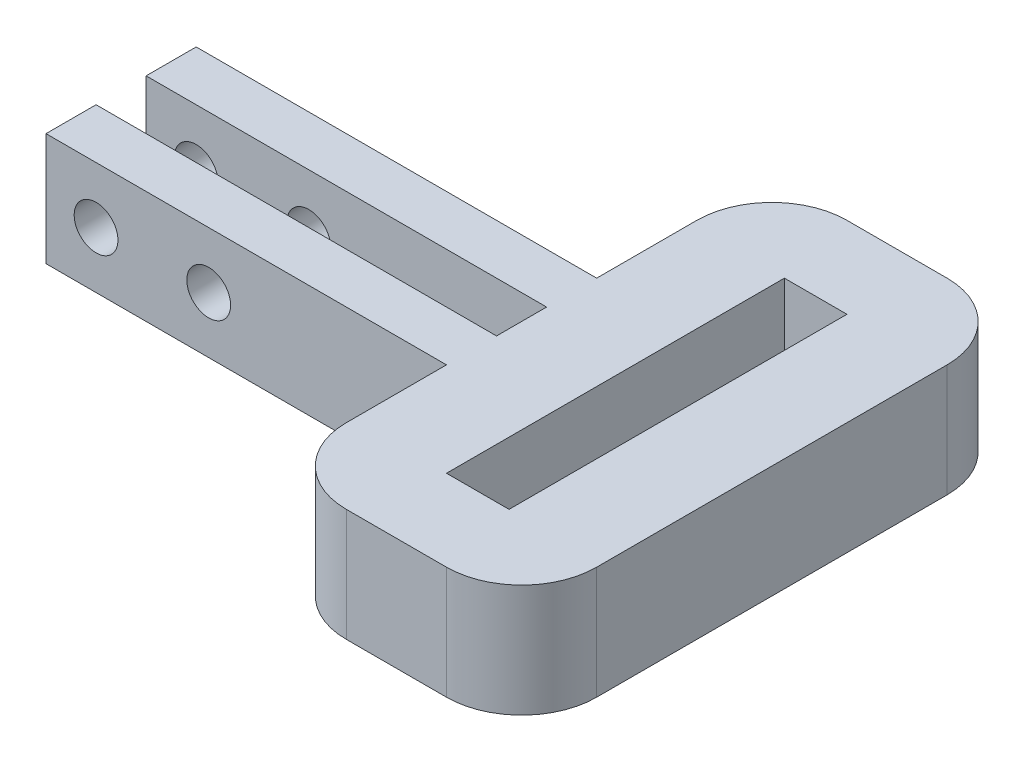
ISO-10303-21;
HEADER;
FILE_DESCRIPTION(('STEP AP214'),'2;1');
FILE_NAME('part.step','',(''),(''),'','','');
FILE_SCHEMA(('AUTOMOTIVE_DESIGN { 1 0 10303 214 1 1 1 1 }'));
ENDSEC;
DATA;
#1=APPLICATION_CONTEXT('core data for automotive mechanical design processes');
#2=APPLICATION_PROTOCOL_DEFINITION('international standard','automotive_design',2000,#1);
#3=PRODUCT_CONTEXT('',#1,'mechanical');
#4=PRODUCT('Part','Part','',(#3));
#5=PRODUCT_RELATED_PRODUCT_CATEGORY('part','',(#4));
#6=PRODUCT_DEFINITION_FORMATION('','',#4);
#7=PRODUCT_DEFINITION_CONTEXT('part definition',#1,'design');
#8=PRODUCT_DEFINITION('design','',#6,#7);
#9=PRODUCT_DEFINITION_SHAPE('','',#8);
#10=(LENGTH_UNIT() NAMED_UNIT(*) SI_UNIT(.MILLI.,.METRE.));
#11=(NAMED_UNIT(*) PLANE_ANGLE_UNIT() SI_UNIT($,.RADIAN.));
#12=(NAMED_UNIT(*) SI_UNIT($,.STERADIAN.) SOLID_ANGLE_UNIT());
#13=UNCERTAINTY_MEASURE_WITH_UNIT(LENGTH_MEASURE(1.E-05),#10,'distance_accuracy_value','');
#14=(GEOMETRIC_REPRESENTATION_CONTEXT(3) GLOBAL_UNCERTAINTY_ASSIGNED_CONTEXT((#13)) GLOBAL_UNIT_ASSIGNED_CONTEXT((#10,
#11,#12)) REPRESENTATION_CONTEXT('',''));
#15=CARTESIAN_POINT('',(0.,0.,0.));
#16=DIRECTION('',(0.,0.,1.));
#17=DIRECTION('',(1.,0.,0.));
#18=AXIS2_PLACEMENT_3D('',#15,#16,#17);
#19=CARTESIAN_POINT('',(-2.,4.5,-7.00000000000001));
#20=DIRECTION('',(0.,-1.,0.));
#21=DIRECTION('',(0.,0.,-1.));
#22=AXIS2_PLACEMENT_3D('',#19,#20,#21);
#23=PLANE('',#22);
#24=CARTESIAN_POINT('',(-2.,4.5,-7.00000000000001));
#25=DIRECTION('',(0.,1.,0.));
#26=DIRECTION('',(0.,0.,-1.));
#27=AXIS2_PLACEMENT_3D('',#24,#25,#26);
#28=CIRCLE('',#27,3.);
#29=CARTESIAN_POINT('',(-2.,4.5,-10.));
#30=VERTEX_POINT('',#29);
#31=CARTESIAN_POINT('',(-5.,4.5,-7.00000000000001));
#32=VERTEX_POINT('',#31);
#33=EDGE_CURVE('E210',#30,#32,#28,.T.);
#34=ORIENTED_EDGE('',*,*,#33,.T.);
#35=DIRECTION('',(0.,0.,1.));
#36=VECTOR('',#35,1.);
#37=CARTESIAN_POINT('',(-5.,4.5,-3.));
#38=LINE('',#37,#36);
#39=CARTESIAN_POINT('',(-5.,4.5,-3.));
#40=VERTEX_POINT('',#39);
#41=EDGE_CURVE('E213',#32,#40,#38,.T.);
#42=ORIENTED_EDGE('',*,*,#41,.T.);
#43=DIRECTION('',(-1.,0.,0.));
#44=VECTOR('',#43,1.);
#45=CARTESIAN_POINT('',(-21.,4.5,-3.));
#46=LINE('',#45,#44);
#47=CARTESIAN_POINT('',(-21.,4.5,-3.));
#48=VERTEX_POINT('',#47);
#49=EDGE_CURVE('E216',#40,#48,#46,.T.);
#50=ORIENTED_EDGE('',*,*,#49,.T.);
#51=DIRECTION('',(0.,0.,1.));
#52=VECTOR('',#51,1.);
#53=CARTESIAN_POINT('',(-21.,4.5,-1.));
#54=LINE('',#53,#52);
#55=CARTESIAN_POINT('',(-21.,4.5,-1.));
#56=VERTEX_POINT('',#55);
#57=EDGE_CURVE('E218',#48,#56,#54,.T.);
#58=ORIENTED_EDGE('',*,*,#57,.T.);
#59=DIRECTION('',(1.,0.,0.));
#60=VECTOR('',#59,1.);
#61=CARTESIAN_POINT('',(-21.,4.5,-1.));
#62=LINE('',#61,#60);
#63=CARTESIAN_POINT('',(-5.,4.5,-1.));
#64=VERTEX_POINT('',#63);
#65=EDGE_CURVE('E220',#56,#64,#62,.T.);
#66=ORIENTED_EDGE('',*,*,#65,.T.);
#67=DIRECTION('',(0.,0.,1.));
#68=VECTOR('',#67,1.);
#69=CARTESIAN_POINT('',(-5.,4.5,-1.));
#70=LINE('',#69,#68);
#71=CARTESIAN_POINT('',(-5.,4.5,1.));
#72=VERTEX_POINT('',#71);
#73=EDGE_CURVE('E222',#64,#72,#70,.T.);
#74=ORIENTED_EDGE('',*,*,#73,.T.);
#75=DIRECTION('',(-1.,0.,0.));
#76=VECTOR('',#75,1.);
#77=CARTESIAN_POINT('',(-5.,4.5,1.));
#78=LINE('',#77,#76);
#79=CARTESIAN_POINT('',(-21.,4.5,1.));
#80=VERTEX_POINT('',#79);
#81=EDGE_CURVE('E224',#72,#80,#78,.T.);
#82=ORIENTED_EDGE('',*,*,#81,.T.);
#83=DIRECTION('',(0.,0.,1.));
#84=VECTOR('',#83,1.);
#85=CARTESIAN_POINT('',(-21.,4.5,1.));
#86=LINE('',#85,#84);
#87=CARTESIAN_POINT('',(-21.,4.5,3.));
#88=VERTEX_POINT('',#87);
#89=EDGE_CURVE('E226',#80,#88,#86,.T.);
#90=ORIENTED_EDGE('',*,*,#89,.T.);
#91=DIRECTION('',(1.,0.,0.));
#92=VECTOR('',#91,1.);
#93=CARTESIAN_POINT('',(-21.,4.5,3.));
#94=LINE('',#93,#92);
#95=CARTESIAN_POINT('',(-5.,4.5,3.));
#96=VERTEX_POINT('',#95);
#97=EDGE_CURVE('E228',#88,#96,#94,.T.);
#98=ORIENTED_EDGE('',*,*,#97,.T.);
#99=DIRECTION('',(0.,0.,1.));
#100=VECTOR('',#99,1.);
#101=CARTESIAN_POINT('',(-5.,4.5,3.));
#102=LINE('',#101,#100);
#103=CARTESIAN_POINT('',(-5.,4.5,6.99999999999999));
#104=VERTEX_POINT('',#103);
#105=EDGE_CURVE('E230',#96,#104,#102,.T.);
#106=ORIENTED_EDGE('',*,*,#105,.T.);
#107=CARTESIAN_POINT('',(-2.,4.5,6.99999999999999));
#108=DIRECTION('',(0.,1.,0.));
#109=DIRECTION('',(0.,0.,-1.));
#110=AXIS2_PLACEMENT_3D('',#107,#108,#109);
#111=CIRCLE('',#110,3.);
#112=CARTESIAN_POINT('',(-2.,4.5,9.99999999999999));
#113=VERTEX_POINT('',#112);
#114=EDGE_CURVE('E232',#104,#113,#111,.T.);
#115=ORIENTED_EDGE('',*,*,#114,.T.);
#116=DIRECTION('',(1.,0.,0.));
#117=VECTOR('',#116,1.);
#118=CARTESIAN_POINT('',(-2.,4.5,9.99999999999999));
#119=LINE('',#118,#117);
#120=CARTESIAN_POINT('',(2.,4.5,9.99999999999999));
#121=VERTEX_POINT('',#120);
#122=EDGE_CURVE('E234',#113,#121,#119,.T.);
#123=ORIENTED_EDGE('',*,*,#122,.T.);
#124=CARTESIAN_POINT('',(2.,4.5,6.99999999999999));
#125=DIRECTION('',(0.,1.,0.));
#126=DIRECTION('',(0.,0.,-1.));
#127=AXIS2_PLACEMENT_3D('',#124,#125,#126);
#128=CIRCLE('',#127,3.);
#129=CARTESIAN_POINT('',(5.,4.5,6.99999999999999));
#130=VERTEX_POINT('',#129);
#131=EDGE_CURVE('E236',#121,#130,#128,.T.);
#132=ORIENTED_EDGE('',*,*,#131,.T.);
#133=DIRECTION('',(0.,0.,-1.));
#134=VECTOR('',#133,1.);
#135=CARTESIAN_POINT('',(5.,4.5,-7.00000000000001));
#136=LINE('',#135,#134);
#137=CARTESIAN_POINT('',(5.,4.5,-7.00000000000001));
#138=VERTEX_POINT('',#137);
#139=EDGE_CURVE('E238',#130,#138,#136,.T.);
#140=ORIENTED_EDGE('',*,*,#139,.T.);
#141=CARTESIAN_POINT('',(2.,4.5,-7.00000000000001));
#142=DIRECTION('',(0.,1.,0.));
#143=DIRECTION('',(0.,0.,1.));
#144=AXIS2_PLACEMENT_3D('',#141,#142,#143);
#145=CIRCLE('',#144,3.);
#146=CARTESIAN_POINT('',(2.,4.5,-10.));
#147=VERTEX_POINT('',#146);
#148=EDGE_CURVE('E240',#138,#147,#145,.T.);
#149=ORIENTED_EDGE('',*,*,#148,.T.);
#150=DIRECTION('',(-1.,0.,0.));
#151=VECTOR('',#150,1.);
#152=CARTESIAN_POINT('',(-2.,4.5,-10.));
#153=LINE('',#152,#151);
#154=EDGE_CURVE('E242',#147,#30,#153,.T.);
#155=ORIENTED_EDGE('',*,*,#154,.T.);
#156=EDGE_LOOP('',(#34,#42,#50,#58,#66,#74,#82,#90,#98,#106,#115,#123,#132,#140,#149,#155));
#157=FACE_BOUND('',#156,.T.);
#158=DIRECTION('',(0.,0.,-1.));
#159=VECTOR('',#158,1.);
#160=CARTESIAN_POINT('',(1.25,4.5,6.75));
#161=LINE('',#160,#159);
#162=CARTESIAN_POINT('',(1.25,4.5,6.75));
#163=VERTEX_POINT('',#162);
#164=CARTESIAN_POINT('',(1.25,4.5,-6.75));
#165=VERTEX_POINT('',#164);
#166=EDGE_CURVE('E172',#163,#165,#161,.T.);
#167=ORIENTED_EDGE('',*,*,#166,.F.);
#168=DIRECTION('',(1.,0.,0.));
#169=VECTOR('',#168,1.);
#170=CARTESIAN_POINT('',(-1.25,4.5,6.75));
#171=LINE('',#170,#169);
#172=CARTESIAN_POINT('',(-1.25,4.5,6.75));
#173=VERTEX_POINT('',#172);
#174=EDGE_CURVE('E194',#173,#163,#171,.T.);
#175=ORIENTED_EDGE('',*,*,#174,.F.);
#176=DIRECTION('',(0.,0.,1.));
#177=VECTOR('',#176,1.);
#178=CARTESIAN_POINT('',(-1.25,4.5,6.75));
#179=LINE('',#178,#177);
#180=CARTESIAN_POINT('',(-1.25,4.5,-6.75));
#181=VERTEX_POINT('',#180);
#182=EDGE_CURVE('E192',#181,#173,#179,.T.);
#183=ORIENTED_EDGE('',*,*,#182,.F.);
#184=DIRECTION('',(-1.,0.,0.));
#185=VECTOR('',#184,1.);
#186=CARTESIAN_POINT('',(-1.25,4.5,-6.75));
#187=LINE('',#186,#185);
#188=EDGE_CURVE('E180',#165,#181,#187,.T.);
#189=ORIENTED_EDGE('',*,*,#188,.F.);
#190=EDGE_LOOP('',(#167,#175,#183,#189));
#191=FACE_BOUND('',#190,.T.);
#192=ADVANCED_FACE('F33',(#157,#191),#23,.F.);
#193=CARTESIAN_POINT('',(-2.,0.,-7.00000000000001));
#194=DIRECTION('',(0.,-1.,0.));
#195=DIRECTION('',(0.,0.,-1.));
#196=AXIS2_PLACEMENT_3D('',#193,#194,#195);
#197=PLANE('',#196);
#198=CARTESIAN_POINT('',(-2.,0.,-7.00000000000001));
#199=DIRECTION('',(0.,1.,0.));
#200=DIRECTION('',(0.,0.,-1.));
#201=AXIS2_PLACEMENT_3D('',#198,#199,#200);
#202=CIRCLE('',#201,3.);
#203=CARTESIAN_POINT('',(-2.,0.,-10.));
#204=VERTEX_POINT('',#203);
#205=CARTESIAN_POINT('',(-5.,0.,-7.00000000000001));
#206=VERTEX_POINT('',#205);
#207=EDGE_CURVE('E188',#204,#206,#202,.T.);
#208=ORIENTED_EDGE('',*,*,#207,.F.);
#209=DIRECTION('',(-1.,0.,0.));
#210=VECTOR('',#209,1.);
#211=CARTESIAN_POINT('',(-2.,0.,-10.));
#212=LINE('',#211,#210);
#213=CARTESIAN_POINT('',(2.,0.,-10.));
#214=VERTEX_POINT('',#213);
#215=EDGE_CURVE('E214',#214,#204,#212,.T.);
#216=ORIENTED_EDGE('',*,*,#215,.F.);
#217=CARTESIAN_POINT('',(2.,0.,-7.00000000000001));
#218=DIRECTION('',(0.,1.,0.));
#219=DIRECTION('',(0.,0.,1.));
#220=AXIS2_PLACEMENT_3D('',#217,#218,#219);
#221=CIRCLE('',#220,3.);
#222=CARTESIAN_POINT('',(5.,0.,-7.00000000000001));
#223=VERTEX_POINT('',#222);
#224=EDGE_CURVE('E273',#223,#214,#221,.T.);
#225=ORIENTED_EDGE('',*,*,#224,.F.);
#226=DIRECTION('',(0.,0.,-1.));
#227=VECTOR('',#226,1.);
#228=CARTESIAN_POINT('',(5.,0.,-7.00000000000001));
#229=LINE('',#228,#227);
#230=CARTESIAN_POINT('',(5.,0.,6.99999999999999));
#231=VERTEX_POINT('',#230);
#232=EDGE_CURVE('E271',#231,#223,#229,.T.);
#233=ORIENTED_EDGE('',*,*,#232,.F.);
#234=CARTESIAN_POINT('',(2.,0.,6.99999999999999));
#235=DIRECTION('',(0.,1.,0.));
#236=DIRECTION('',(0.,0.,-1.));
#237=AXIS2_PLACEMENT_3D('',#234,#235,#236);
#238=CIRCLE('',#237,3.);
#239=CARTESIAN_POINT('',(2.,0.,9.99999999999999));
#240=VERTEX_POINT('',#239);
#241=EDGE_CURVE('E269',#240,#231,#238,.T.);
#242=ORIENTED_EDGE('',*,*,#241,.F.);
#243=DIRECTION('',(1.,0.,0.));
#244=VECTOR('',#243,1.);
#245=CARTESIAN_POINT('',(-2.,0.,9.99999999999999));
#246=LINE('',#245,#244);
#247=CARTESIAN_POINT('',(-2.,0.,9.99999999999999));
#248=VERTEX_POINT('',#247);
#249=EDGE_CURVE('E267',#248,#240,#246,.T.);
#250=ORIENTED_EDGE('',*,*,#249,.F.);
#251=CARTESIAN_POINT('',(-2.,0.,6.99999999999999));
#252=DIRECTION('',(0.,1.,0.));
#253=DIRECTION('',(0.,0.,-1.));
#254=AXIS2_PLACEMENT_3D('',#251,#252,#253);
#255=CIRCLE('',#254,3.);
#256=CARTESIAN_POINT('',(-5.,0.,6.99999999999999));
#257=VERTEX_POINT('',#256);
#258=EDGE_CURVE('E265',#257,#248,#255,.T.);
#259=ORIENTED_EDGE('',*,*,#258,.F.);
#260=DIRECTION('',(0.,0.,1.));
#261=VECTOR('',#260,1.);
#262=CARTESIAN_POINT('',(-5.,0.,3.));
#263=LINE('',#262,#261);
#264=CARTESIAN_POINT('',(-5.,0.,3.));
#265=VERTEX_POINT('',#264);
#266=EDGE_CURVE('E263',#265,#257,#263,.T.);
#267=ORIENTED_EDGE('',*,*,#266,.F.);
#268=DIRECTION('',(1.,0.,0.));
#269=VECTOR('',#268,1.);
#270=CARTESIAN_POINT('',(-21.,0.,3.));
#271=LINE('',#270,#269);
#272=CARTESIAN_POINT('',(-21.,0.,3.));
#273=VERTEX_POINT('',#272);
#274=EDGE_CURVE('E261',#273,#265,#271,.T.);
#275=ORIENTED_EDGE('',*,*,#274,.F.);
#276=DIRECTION('',(0.,0.,1.));
#277=VECTOR('',#276,1.);
#278=CARTESIAN_POINT('',(-21.,0.,1.));
#279=LINE('',#278,#277);
#280=CARTESIAN_POINT('',(-21.,0.,1.));
#281=VERTEX_POINT('',#280);
#282=EDGE_CURVE('E259',#281,#273,#279,.T.);
#283=ORIENTED_EDGE('',*,*,#282,.F.);
#284=DIRECTION('',(-1.,0.,0.));
#285=VECTOR('',#284,1.);
#286=CARTESIAN_POINT('',(-5.,0.,1.));
#287=LINE('',#286,#285);
#288=CARTESIAN_POINT('',(-5.,0.,1.));
#289=VERTEX_POINT('',#288);
#290=EDGE_CURVE('E257',#289,#281,#287,.T.);
#291=ORIENTED_EDGE('',*,*,#290,.F.);
#292=DIRECTION('',(0.,0.,1.));
#293=VECTOR('',#292,1.);
#294=CARTESIAN_POINT('',(-5.,0.,-1.));
#295=LINE('',#294,#293);
#296=CARTESIAN_POINT('',(-5.,0.,-1.));
#297=VERTEX_POINT('',#296);
#298=EDGE_CURVE('E255',#297,#289,#295,.T.);
#299=ORIENTED_EDGE('',*,*,#298,.F.);
#300=DIRECTION('',(1.,0.,0.));
#301=VECTOR('',#300,1.);
#302=CARTESIAN_POINT('',(-21.,0.,-1.));
#303=LINE('',#302,#301);
#304=CARTESIAN_POINT('',(-21.,0.,-1.));
#305=VERTEX_POINT('',#304);
#306=EDGE_CURVE('E253',#305,#297,#303,.T.);
#307=ORIENTED_EDGE('',*,*,#306,.F.);
#308=DIRECTION('',(0.,0.,1.));
#309=VECTOR('',#308,1.);
#310=CARTESIAN_POINT('',(-21.,0.,-1.));
#311=LINE('',#310,#309);
#312=CARTESIAN_POINT('',(-21.,0.,-3.));
#313=VERTEX_POINT('',#312);
#314=EDGE_CURVE('E251',#313,#305,#311,.T.);
#315=ORIENTED_EDGE('',*,*,#314,.F.);
#316=DIRECTION('',(-1.,0.,0.));
#317=VECTOR('',#316,1.);
#318=CARTESIAN_POINT('',(-21.,0.,-3.));
#319=LINE('',#318,#317);
#320=CARTESIAN_POINT('',(-5.,0.,-3.));
#321=VERTEX_POINT('',#320);
#322=EDGE_CURVE('E249',#321,#313,#319,.T.);
#323=ORIENTED_EDGE('',*,*,#322,.F.);
#324=DIRECTION('',(0.,0.,1.));
#325=VECTOR('',#324,1.);
#326=CARTESIAN_POINT('',(-5.,0.,-3.));
#327=LINE('',#326,#325);
#328=EDGE_CURVE('E247',#206,#321,#327,.T.);
#329=ORIENTED_EDGE('',*,*,#328,.F.);
#330=EDGE_LOOP('',(#208,#216,#225,#233,#242,#250,#259,#267,#275,#283,#291,#299,#307,#315,#323,#329));
#331=FACE_BOUND('',#330,.T.);
#332=DIRECTION('',(1.,0.,0.));
#333=VECTOR('',#332,1.);
#334=CARTESIAN_POINT('',(-1.25,0.,6.75));
#335=LINE('',#334,#333);
#336=CARTESIAN_POINT('',(-1.25,0.,6.75));
#337=VERTEX_POINT('',#336);
#338=CARTESIAN_POINT('',(1.25,0.,6.75));
#339=VERTEX_POINT('',#338);
#340=EDGE_CURVE('E181',#337,#339,#335,.T.);
#341=ORIENTED_EDGE('',*,*,#340,.T.);
#342=DIRECTION('',(0.,0.,-1.));
#343=VECTOR('',#342,1.);
#344=CARTESIAN_POINT('',(1.25,0.,6.75));
#345=LINE('',#344,#343);
#346=CARTESIAN_POINT('',(1.25,0.,-6.75));
#347=VERTEX_POINT('',#346);
#348=EDGE_CURVE('E58',#339,#347,#345,.T.);
#349=ORIENTED_EDGE('',*,*,#348,.T.);
#350=DIRECTION('',(-1.,0.,0.));
#351=VECTOR('',#350,1.);
#352=CARTESIAN_POINT('',(-1.25,0.,-6.75));
#353=LINE('',#352,#351);
#354=CARTESIAN_POINT('',(-1.25,0.,-6.75));
#355=VERTEX_POINT('',#354);
#356=EDGE_CURVE('E187',#347,#355,#353,.T.);
#357=ORIENTED_EDGE('',*,*,#356,.T.);
#358=DIRECTION('',(0.,0.,1.));
#359=VECTOR('',#358,1.);
#360=CARTESIAN_POINT('',(-1.25,0.,6.75));
#361=LINE('',#360,#359);
#362=EDGE_CURVE('E202',#355,#337,#361,.T.);
#363=ORIENTED_EDGE('',*,*,#362,.T.);
#364=EDGE_LOOP('',(#341,#349,#357,#363));
#365=FACE_BOUND('',#364,.T.);
#366=ADVANCED_FACE('F361',(#331,#365),#197,.T.);
#367=CARTESIAN_POINT('',(-2.,4.5,-7.00000000000001));
#368=DIRECTION('',(0.,-1.,0.));
#369=DIRECTION('',(0.,0.,-1.));
#370=AXIS2_PLACEMENT_3D('',#367,#368,#369);
#371=CYLINDRICAL_SURFACE('',#370,3.);
#372=ORIENTED_EDGE('',*,*,#207,.T.);
#373=DIRECTION('',(0.,-1.,0.));
#374=VECTOR('',#373,1.);
#375=CARTESIAN_POINT('',(-5.,4.5,-7.00000000000001));
#376=LINE('',#375,#374);
#377=EDGE_CURVE('E11',#32,#206,#376,.T.);
#378=ORIENTED_EDGE('',*,*,#377,.F.);
#379=ORIENTED_EDGE('',*,*,#33,.F.);
#380=DIRECTION('',(0.,-1.,0.));
#381=VECTOR('',#380,1.);
#382=CARTESIAN_POINT('',(-2.,4.5,-10.));
#383=LINE('',#382,#381);
#384=EDGE_CURVE('E244',#30,#204,#383,.T.);
#385=ORIENTED_EDGE('',*,*,#384,.T.);
#386=EDGE_LOOP('',(#372,#378,#379,#385));
#387=FACE_BOUND('',#386,.T.);
#388=ADVANCED_FACE('F35',(#387),#371,.T.);
#389=CARTESIAN_POINT('',(-5.,4.5,-3.));
#390=DIRECTION('',(1.,0.,0.));
#391=DIRECTION('',(0.,0.,-1.));
#392=AXIS2_PLACEMENT_3D('',#389,#390,#391);
#393=PLANE('',#392);
#394=ORIENTED_EDGE('',*,*,#328,.T.);
#395=DIRECTION('',(0.,-1.,0.));
#396=VECTOR('',#395,1.);
#397=CARTESIAN_POINT('',(-5.,4.5,-3.));
#398=LINE('',#397,#396);
#399=EDGE_CURVE('E42',#40,#321,#398,.T.);
#400=ORIENTED_EDGE('',*,*,#399,.F.);
#401=ORIENTED_EDGE('',*,*,#41,.F.);
#402=ORIENTED_EDGE('',*,*,#377,.T.);
#403=EDGE_LOOP('',(#394,#400,#401,#402));
#404=FACE_BOUND('',#403,.T.);
#405=ADVANCED_FACE('F347',(#404),#393,.F.);
#406=CARTESIAN_POINT('',(-21.,4.5,-3.));
#407=DIRECTION('',(0.,0.,1.));
#408=DIRECTION('',(1.,0.,0.));
#409=AXIS2_PLACEMENT_3D('',#406,#407,#408);
#410=PLANE('',#409);
#411=CARTESIAN_POINT('',(-14.5,2.25,-3.));
#412=DIRECTION('',(0.,0.,1.));
#413=DIRECTION('',(1.,0.,0.));
#414=AXIS2_PLACEMENT_3D('',#411,#412,#413);
#415=CIRCLE('',#414,0.875);
#416=CARTESIAN_POINT('',(-13.625,2.25,-3.));
#417=VERTEX_POINT('',#416);
#418=EDGE_CURVE('E321',#417,#417,#415,.F.);
#419=ORIENTED_EDGE('',*,*,#418,.F.);
#420=EDGE_LOOP('',(#419));
#421=FACE_BOUND('',#420,.T.);
#422=CARTESIAN_POINT('',(-19.,2.25,-3.));
#423=DIRECTION('',(0.,0.,1.));
#424=DIRECTION('',(1.,0.,0.));
#425=AXIS2_PLACEMENT_3D('',#422,#423,#424);
#426=CIRCLE('',#425,0.875000000000002);
#427=CARTESIAN_POINT('',(-18.125,2.25,-3.));
#428=VERTEX_POINT('',#427);
#429=EDGE_CURVE('E200',#428,#428,#426,.F.);
#430=ORIENTED_EDGE('',*,*,#429,.F.);
#431=EDGE_LOOP('',(#430));
#432=FACE_BOUND('',#431,.T.);
#433=ORIENTED_EDGE('',*,*,#322,.T.);
#434=DIRECTION('',(0.,-1.,0.));
#435=VECTOR('',#434,1.);
#436=CARTESIAN_POINT('',(-21.,4.5,-3.));
#437=LINE('',#436,#435);
#438=EDGE_CURVE('E314',#48,#313,#437,.T.);
#439=ORIENTED_EDGE('',*,*,#438,.F.);
#440=ORIENTED_EDGE('',*,*,#49,.F.);
#441=ORIENTED_EDGE('',*,*,#399,.T.);
#442=EDGE_LOOP('',(#433,#439,#440,#441));
#443=FACE_BOUND('',#442,.T.);
#444=ADVANCED_FACE('F343',(#421,#432,#443),#410,.F.);
#445=CARTESIAN_POINT('',(-21.,4.5,-1.));
#446=DIRECTION('',(1.,0.,0.));
#447=DIRECTION('',(0.,0.,-1.));
#448=AXIS2_PLACEMENT_3D('',#445,#446,#447);
#449=PLANE('',#448);
#450=ORIENTED_EDGE('',*,*,#314,.T.);
#451=DIRECTION('',(0.,-1.,0.));
#452=VECTOR('',#451,1.);
#453=CARTESIAN_POINT('',(-21.,4.5,-1.));
#454=LINE('',#453,#452);
#455=EDGE_CURVE('E311',#56,#305,#454,.T.);
#456=ORIENTED_EDGE('',*,*,#455,.F.);
#457=ORIENTED_EDGE('',*,*,#57,.F.);
#458=ORIENTED_EDGE('',*,*,#438,.T.);
#459=EDGE_LOOP('',(#450,#456,#457,#458));
#460=FACE_BOUND('',#459,.T.);
#461=ADVANCED_FACE('F346',(#460),#449,.F.);
#462=CARTESIAN_POINT('',(-21.,4.5,-1.));
#463=DIRECTION('',(0.,0.,-1.));
#464=DIRECTION('',(-1.,0.,0.));
#465=AXIS2_PLACEMENT_3D('',#462,#463,#464);
#466=PLANE('',#465);
#467=CARTESIAN_POINT('',(-14.5,2.25,-1.));
#468=DIRECTION('',(0.,0.,-1.));
#469=DIRECTION('',(-1.,0.,0.));
#470=AXIS2_PLACEMENT_3D('',#467,#468,#469);
#471=CIRCLE('',#470,0.875);
#472=CARTESIAN_POINT('',(-15.375,2.25,-1.));
#473=VERTEX_POINT('',#472);
#474=EDGE_CURVE('E328',#473,#473,#471,.F.);
#475=ORIENTED_EDGE('',*,*,#474,.F.);
#476=EDGE_LOOP('',(#475));
#477=FACE_BOUND('',#476,.T.);
#478=CARTESIAN_POINT('',(-19.,2.25,-1.));
#479=DIRECTION('',(0.,0.,-1.));
#480=DIRECTION('',(-1.,0.,0.));
#481=AXIS2_PLACEMENT_3D('',#478,#479,#480);
#482=CIRCLE('',#481,0.875000000000002);
#483=CARTESIAN_POINT('',(-19.875,2.25,-1.));
#484=VERTEX_POINT('',#483);
#485=EDGE_CURVE('E325',#484,#484,#482,.F.);
#486=ORIENTED_EDGE('',*,*,#485,.F.);
#487=EDGE_LOOP('',(#486));
#488=FACE_BOUND('',#487,.T.);
#489=ORIENTED_EDGE('',*,*,#306,.T.);
#490=DIRECTION('',(0.,-1.,0.));
#491=VECTOR('',#490,1.);
#492=CARTESIAN_POINT('',(-5.,4.5,-1.));
#493=LINE('',#492,#491);
#494=EDGE_CURVE('E308',#64,#297,#493,.T.);
#495=ORIENTED_EDGE('',*,*,#494,.F.);
#496=ORIENTED_EDGE('',*,*,#65,.F.);
#497=ORIENTED_EDGE('',*,*,#455,.T.);
#498=EDGE_LOOP('',(#489,#495,#496,#497));
#499=FACE_BOUND('',#498,.T.);
#500=ADVANCED_FACE('F367',(#477,#488,#499),#466,.F.);
#501=CARTESIAN_POINT('',(-5.,4.5,-1.));
#502=DIRECTION('',(1.,0.,0.));
#503=DIRECTION('',(0.,0.,-1.));
#504=AXIS2_PLACEMENT_3D('',#501,#502,#503);
#505=PLANE('',#504);
#506=ORIENTED_EDGE('',*,*,#298,.T.);
#507=DIRECTION('',(0.,-1.,0.));
#508=VECTOR('',#507,1.);
#509=CARTESIAN_POINT('',(-5.,4.5,1.));
#510=LINE('',#509,#508);
#511=EDGE_CURVE('E305',#72,#289,#510,.T.);
#512=ORIENTED_EDGE('',*,*,#511,.F.);
#513=ORIENTED_EDGE('',*,*,#73,.F.);
#514=ORIENTED_EDGE('',*,*,#494,.T.);
#515=EDGE_LOOP('',(#506,#512,#513,#514));
#516=FACE_BOUND('',#515,.T.);
#517=ADVANCED_FACE('F371',(#516),#505,.F.);
#518=CARTESIAN_POINT('',(-5.,4.5,1.));
#519=DIRECTION('',(0.,0.,1.));
#520=DIRECTION('',(1.,0.,0.));
#521=AXIS2_PLACEMENT_3D('',#518,#519,#520);
#522=PLANE('',#521);
#523=CARTESIAN_POINT('',(-14.5,2.25,1.));
#524=DIRECTION('',(0.,0.,1.));
#525=DIRECTION('',(1.,0.,0.));
#526=AXIS2_PLACEMENT_3D('',#523,#524,#525);
#527=CIRCLE('',#526,0.875);
#528=CARTESIAN_POINT('',(-13.625,2.25,1.));
#529=VERTEX_POINT('',#528);
#530=EDGE_CURVE('E333',#529,#529,#527,.F.);
#531=ORIENTED_EDGE('',*,*,#530,.F.);
#532=EDGE_LOOP('',(#531));
#533=FACE_BOUND('',#532,.T.);
#534=CARTESIAN_POINT('',(-19.,2.25,1.));
#535=DIRECTION('',(0.,0.,1.));
#536=DIRECTION('',(1.,0.,0.));
#537=AXIS2_PLACEMENT_3D('',#534,#535,#536);
#538=CIRCLE('',#537,0.875000000000002);
#539=CARTESIAN_POINT('',(-18.125,2.25,1.));
#540=VERTEX_POINT('',#539);
#541=EDGE_CURVE('E320',#540,#540,#538,.F.);
#542=ORIENTED_EDGE('',*,*,#541,.F.);
#543=EDGE_LOOP('',(#542));
#544=FACE_BOUND('',#543,.T.);
#545=ORIENTED_EDGE('',*,*,#290,.T.);
#546=DIRECTION('',(0.,-1.,0.));
#547=VECTOR('',#546,1.);
#548=CARTESIAN_POINT('',(-21.,4.5,1.));
#549=LINE('',#548,#547);
#550=EDGE_CURVE('E302',#80,#281,#549,.T.);
#551=ORIENTED_EDGE('',*,*,#550,.F.);
#552=ORIENTED_EDGE('',*,*,#81,.F.);
#553=ORIENTED_EDGE('',*,*,#511,.T.);
#554=EDGE_LOOP('',(#545,#551,#552,#553));
#555=FACE_BOUND('',#554,.T.);
#556=ADVANCED_FACE('F426',(#533,#544,#555),#522,.F.);
#557=CARTESIAN_POINT('',(-21.,4.5,1.));
#558=DIRECTION('',(1.,0.,0.));
#559=DIRECTION('',(0.,0.,-1.));
#560=AXIS2_PLACEMENT_3D('',#557,#558,#559);
#561=PLANE('',#560);
#562=ORIENTED_EDGE('',*,*,#282,.T.);
#563=DIRECTION('',(0.,-1.,0.));
#564=VECTOR('',#563,1.);
#565=CARTESIAN_POINT('',(-21.,4.5,3.));
#566=LINE('',#565,#564);
#567=EDGE_CURVE('E299',#88,#273,#566,.T.);
#568=ORIENTED_EDGE('',*,*,#567,.F.);
#569=ORIENTED_EDGE('',*,*,#89,.F.);
#570=ORIENTED_EDGE('',*,*,#550,.T.);
#571=EDGE_LOOP('',(#562,#568,#569,#570));
#572=FACE_BOUND('',#571,.T.);
#573=ADVANCED_FACE('F423',(#572),#561,.F.);
#574=CARTESIAN_POINT('',(-21.,4.5,3.));
#575=DIRECTION('',(0.,0.,-1.));
#576=DIRECTION('',(-1.,0.,0.));
#577=AXIS2_PLACEMENT_3D('',#574,#575,#576);
#578=PLANE('',#577);
#579=CARTESIAN_POINT('',(-14.5,2.25,3.));
#580=DIRECTION('',(0.,0.,-1.));
#581=DIRECTION('',(-1.,0.,0.));
#582=AXIS2_PLACEMENT_3D('',#579,#580,#581);
#583=CIRCLE('',#582,0.875);
#584=CARTESIAN_POINT('',(-15.375,2.25,3.));
#585=VERTEX_POINT('',#584);
#586=EDGE_CURVE('E37',#585,#585,#583,.F.);
#587=ORIENTED_EDGE('',*,*,#586,.F.);
#588=EDGE_LOOP('',(#587));
#589=FACE_BOUND('',#588,.T.);
#590=CARTESIAN_POINT('',(-19.,2.25,3.));
#591=DIRECTION('',(0.,0.,-1.));
#592=DIRECTION('',(-1.,0.,0.));
#593=AXIS2_PLACEMENT_3D('',#590,#591,#592);
#594=CIRCLE('',#593,0.875000000000002);
#595=CARTESIAN_POINT('',(-19.875,2.25,3.));
#596=VERTEX_POINT('',#595);
#597=EDGE_CURVE('E318',#596,#596,#594,.F.);
#598=ORIENTED_EDGE('',*,*,#597,.F.);
#599=EDGE_LOOP('',(#598));
#600=FACE_BOUND('',#599,.T.);
#601=ORIENTED_EDGE('',*,*,#274,.T.);
#602=DIRECTION('',(0.,-1.,0.));
#603=VECTOR('',#602,1.);
#604=CARTESIAN_POINT('',(-5.,4.5,3.));
#605=LINE('',#604,#603);
#606=EDGE_CURVE('E296',#96,#265,#605,.T.);
#607=ORIENTED_EDGE('',*,*,#606,.F.);
#608=ORIENTED_EDGE('',*,*,#97,.F.);
#609=ORIENTED_EDGE('',*,*,#567,.T.);
#610=EDGE_LOOP('',(#601,#607,#608,#609));
#611=FACE_BOUND('',#610,.T.);
#612=ADVANCED_FACE('F419',(#589,#600,#611),#578,.F.);
#613=CARTESIAN_POINT('',(-5.,4.5,3.));
#614=DIRECTION('',(1.,0.,0.));
#615=DIRECTION('',(0.,0.,-1.));
#616=AXIS2_PLACEMENT_3D('',#613,#614,#615);
#617=PLANE('',#616);
#618=ORIENTED_EDGE('',*,*,#266,.T.);
#619=DIRECTION('',(0.,-1.,0.));
#620=VECTOR('',#619,1.);
#621=CARTESIAN_POINT('',(-5.,4.5,6.99999999999999));
#622=LINE('',#621,#620);
#623=EDGE_CURVE('E293',#104,#257,#622,.T.);
#624=ORIENTED_EDGE('',*,*,#623,.F.);
#625=ORIENTED_EDGE('',*,*,#105,.F.);
#626=ORIENTED_EDGE('',*,*,#606,.T.);
#627=EDGE_LOOP('',(#618,#624,#625,#626));
#628=FACE_BOUND('',#627,.T.);
#629=ADVANCED_FACE('F415',(#628),#617,.F.);
#630=CARTESIAN_POINT('',(-2.,4.5,6.99999999999999));
#631=DIRECTION('',(0.,-1.,0.));
#632=DIRECTION('',(0.,0.,-1.));
#633=AXIS2_PLACEMENT_3D('',#630,#631,#632);
#634=CYLINDRICAL_SURFACE('',#633,3.);
#635=ORIENTED_EDGE('',*,*,#258,.T.);
#636=DIRECTION('',(0.,-1.,0.));
#637=VECTOR('',#636,1.);
#638=CARTESIAN_POINT('',(-2.,4.5,9.99999999999999));
#639=LINE('',#638,#637);
#640=EDGE_CURVE('E290',#113,#248,#639,.T.);
#641=ORIENTED_EDGE('',*,*,#640,.F.);
#642=ORIENTED_EDGE('',*,*,#114,.F.);
#643=ORIENTED_EDGE('',*,*,#623,.T.);
#644=EDGE_LOOP('',(#635,#641,#642,#643));
#645=FACE_BOUND('',#644,.T.);
#646=ADVANCED_FACE('F410',(#645),#634,.T.);
#647=CARTESIAN_POINT('',(-2.,4.5,9.99999999999999));
#648=DIRECTION('',(0.,0.,-1.));
#649=DIRECTION('',(-1.,0.,0.));
#650=AXIS2_PLACEMENT_3D('',#647,#648,#649);
#651=PLANE('',#650);
#652=ORIENTED_EDGE('',*,*,#249,.T.);
#653=DIRECTION('',(0.,-1.,0.));
#654=VECTOR('',#653,1.);
#655=CARTESIAN_POINT('',(2.,4.5,9.99999999999999));
#656=LINE('',#655,#654);
#657=EDGE_CURVE('E287',#121,#240,#656,.T.);
#658=ORIENTED_EDGE('',*,*,#657,.F.);
#659=ORIENTED_EDGE('',*,*,#122,.F.);
#660=ORIENTED_EDGE('',*,*,#640,.T.);
#661=EDGE_LOOP('',(#652,#658,#659,#660));
#662=FACE_BOUND('',#661,.T.);
#663=ADVANCED_FACE('F404',(#662),#651,.F.);
#664=CARTESIAN_POINT('',(2.,4.5,6.99999999999999));
#665=DIRECTION('',(0.,-1.,0.));
#666=DIRECTION('',(0.,0.,-1.));
#667=AXIS2_PLACEMENT_3D('',#664,#665,#666);
#668=CYLINDRICAL_SURFACE('',#667,3.);
#669=ORIENTED_EDGE('',*,*,#241,.T.);
#670=DIRECTION('',(0.,-1.,0.));
#671=VECTOR('',#670,1.);
#672=CARTESIAN_POINT('',(5.,4.5,6.99999999999999));
#673=LINE('',#672,#671);
#674=EDGE_CURVE('E284',#130,#231,#673,.T.);
#675=ORIENTED_EDGE('',*,*,#674,.F.);
#676=ORIENTED_EDGE('',*,*,#131,.F.);
#677=ORIENTED_EDGE('',*,*,#657,.T.);
#678=EDGE_LOOP('',(#669,#675,#676,#677));
#679=FACE_BOUND('',#678,.T.);
#680=ADVANCED_FACE('F400',(#679),#668,.T.);
#681=CARTESIAN_POINT('',(5.,4.5,-7.00000000000001));
#682=DIRECTION('',(-1.,0.,0.));
#683=DIRECTION('',(0.,0.,1.));
#684=AXIS2_PLACEMENT_3D('',#681,#682,#683);
#685=PLANE('',#684);
#686=ORIENTED_EDGE('',*,*,#232,.T.);
#687=DIRECTION('',(0.,-1.,0.));
#688=VECTOR('',#687,1.);
#689=CARTESIAN_POINT('',(5.,4.5,-7.00000000000001));
#690=LINE('',#689,#688);
#691=EDGE_CURVE('E281',#138,#223,#690,.T.);
#692=ORIENTED_EDGE('',*,*,#691,.F.);
#693=ORIENTED_EDGE('',*,*,#139,.F.);
#694=ORIENTED_EDGE('',*,*,#674,.T.);
#695=EDGE_LOOP('',(#686,#692,#693,#694));
#696=FACE_BOUND('',#695,.T.);
#697=ADVANCED_FACE('F395',(#696),#685,.F.);
#698=CARTESIAN_POINT('',(2.,4.5,-7.00000000000001));
#699=DIRECTION('',(0.,-1.,0.));
#700=DIRECTION('',(0.,0.,-1.));
#701=AXIS2_PLACEMENT_3D('',#698,#699,#700);
#702=CYLINDRICAL_SURFACE('',#701,3.);
#703=ORIENTED_EDGE('',*,*,#224,.T.);
#704=DIRECTION('',(0.,-1.,0.));
#705=VECTOR('',#704,1.);
#706=CARTESIAN_POINT('',(2.,4.5,-10.));
#707=LINE('',#706,#705);
#708=EDGE_CURVE('E278',#147,#214,#707,.T.);
#709=ORIENTED_EDGE('',*,*,#708,.F.);
#710=ORIENTED_EDGE('',*,*,#148,.F.);
#711=ORIENTED_EDGE('',*,*,#691,.T.);
#712=EDGE_LOOP('',(#703,#709,#710,#711));
#713=FACE_BOUND('',#712,.T.);
#714=ADVANCED_FACE('F389',(#713),#702,.T.);
#715=CARTESIAN_POINT('',(-2.,4.5,-10.));
#716=DIRECTION('',(0.,0.,1.));
#717=DIRECTION('',(1.,0.,0.));
#718=AXIS2_PLACEMENT_3D('',#715,#716,#717);
#719=PLANE('',#718);
#720=ORIENTED_EDGE('',*,*,#215,.T.);
#721=ORIENTED_EDGE('',*,*,#384,.F.);
#722=ORIENTED_EDGE('',*,*,#154,.F.);
#723=ORIENTED_EDGE('',*,*,#708,.T.);
#724=EDGE_LOOP('',(#720,#721,#722,#723));
#725=FACE_BOUND('',#724,.T.);
#726=ADVANCED_FACE('F385',(#725),#719,.F.);
#727=CARTESIAN_POINT('',(1.25,4.5,6.75));
#728=DIRECTION('',(-1.,0.,0.));
#729=DIRECTION('',(0.,0.,1.));
#730=AXIS2_PLACEMENT_3D('',#727,#728,#729);
#731=PLANE('',#730);
#732=ORIENTED_EDGE('',*,*,#348,.F.);
#733=DIRECTION('',(0.,-1.,0.));
#734=VECTOR('',#733,1.);
#735=CARTESIAN_POINT('',(1.25,4.5,6.75));
#736=LINE('',#735,#734);
#737=EDGE_CURVE('E176',#163,#339,#736,.T.);
#738=ORIENTED_EDGE('',*,*,#737,.F.);
#739=ORIENTED_EDGE('',*,*,#166,.T.);
#740=DIRECTION('',(0.,-1.,0.));
#741=VECTOR('',#740,1.);
#742=CARTESIAN_POINT('',(1.25,4.5,-6.75));
#743=LINE('',#742,#741);
#744=EDGE_CURVE('E175',#165,#347,#743,.T.);
#745=ORIENTED_EDGE('',*,*,#744,.T.);
#746=EDGE_LOOP('',(#732,#738,#739,#745));
#747=FACE_BOUND('',#746,.T.);
#748=ADVANCED_FACE('F174',(#747),#731,.T.);
#749=CARTESIAN_POINT('',(-1.25,4.5,-6.75));
#750=DIRECTION('',(0.,0.,1.));
#751=DIRECTION('',(1.,0.,0.));
#752=AXIS2_PLACEMENT_3D('',#749,#750,#751);
#753=PLANE('',#752);
#754=ORIENTED_EDGE('',*,*,#356,.F.);
#755=ORIENTED_EDGE('',*,*,#744,.F.);
#756=ORIENTED_EDGE('',*,*,#188,.T.);
#757=DIRECTION('',(0.,-1.,0.));
#758=VECTOR('',#757,1.);
#759=CARTESIAN_POINT('',(-1.25,4.5,-6.75));
#760=LINE('',#759,#758);
#761=EDGE_CURVE('E189',#181,#355,#760,.T.);
#762=ORIENTED_EDGE('',*,*,#761,.T.);
#763=EDGE_LOOP('',(#754,#755,#756,#762));
#764=FACE_BOUND('',#763,.T.);
#765=ADVANCED_FACE('F184',(#764),#753,.T.);
#766=CARTESIAN_POINT('',(-1.25,4.5,6.75));
#767=DIRECTION('',(1.,0.,0.));
#768=DIRECTION('',(0.,0.,-1.));
#769=AXIS2_PLACEMENT_3D('',#766,#767,#768);
#770=PLANE('',#769);
#771=ORIENTED_EDGE('',*,*,#362,.F.);
#772=ORIENTED_EDGE('',*,*,#761,.F.);
#773=ORIENTED_EDGE('',*,*,#182,.T.);
#774=DIRECTION('',(0.,-1.,0.));
#775=VECTOR('',#774,1.);
#776=CARTESIAN_POINT('',(-1.25,4.5,6.75));
#777=LINE('',#776,#775);
#778=EDGE_CURVE('E50',#173,#337,#777,.T.);
#779=ORIENTED_EDGE('',*,*,#778,.T.);
#780=EDGE_LOOP('',(#771,#772,#773,#779));
#781=FACE_BOUND('',#780,.T.);
#782=ADVANCED_FACE('F487',(#781),#770,.T.);
#783=CARTESIAN_POINT('',(-1.25,4.5,6.75));
#784=DIRECTION('',(0.,0.,-1.));
#785=DIRECTION('',(-1.,0.,0.));
#786=AXIS2_PLACEMENT_3D('',#783,#784,#785);
#787=PLANE('',#786);
#788=ORIENTED_EDGE('',*,*,#340,.F.);
#789=ORIENTED_EDGE('',*,*,#778,.F.);
#790=ORIENTED_EDGE('',*,*,#174,.T.);
#791=ORIENTED_EDGE('',*,*,#737,.T.);
#792=EDGE_LOOP('',(#788,#789,#790,#791));
#793=FACE_BOUND('',#792,.T.);
#794=ADVANCED_FACE('F484',(#793),#787,.T.);
#795=CARTESIAN_POINT('',(-19.,2.25,13.));
#796=DIRECTION('',(0.,0.,-1.));
#797=DIRECTION('',(-1.,0.,0.));
#798=AXIS2_PLACEMENT_3D('',#795,#796,#797);
#799=CYLINDRICAL_SURFACE('',#798,0.875000000000002);
#800=ORIENTED_EDGE('',*,*,#597,.T.);
#801=EDGE_LOOP('',(#800));
#802=FACE_BOUND('',#801,.T.);
#803=ORIENTED_EDGE('',*,*,#541,.T.);
#804=EDGE_LOOP('',(#803));
#805=FACE_BOUND('',#804,.T.);
#806=ADVANCED_FACE('F480',(#802,#805),#799,.F.);
#807=ORIENTED_EDGE('',*,*,#485,.T.);
#808=EDGE_LOOP('',(#807));
#809=FACE_BOUND('',#808,.T.);
#810=ORIENTED_EDGE('',*,*,#429,.T.);
#811=EDGE_LOOP('',(#810));
#812=FACE_BOUND('',#811,.T.);
#813=ADVANCED_FACE('F341',(#809,#812),#799,.F.);
#814=CARTESIAN_POINT('',(-14.5,2.25,13.));
#815=DIRECTION('',(0.,0.,-1.));
#816=DIRECTION('',(-1.,0.,0.));
#817=AXIS2_PLACEMENT_3D('',#814,#815,#816);
#818=CYLINDRICAL_SURFACE('',#817,0.875);
#819=ORIENTED_EDGE('',*,*,#586,.T.);
#820=EDGE_LOOP('',(#819));
#821=FACE_BOUND('',#820,.T.);
#822=ORIENTED_EDGE('',*,*,#530,.T.);
#823=EDGE_LOOP('',(#822));
#824=FACE_BOUND('',#823,.T.);
#825=ADVANCED_FACE('F471',(#821,#824),#818,.F.);
#826=ORIENTED_EDGE('',*,*,#474,.T.);
#827=EDGE_LOOP('',(#826));
#828=FACE_BOUND('',#827,.T.);
#829=ORIENTED_EDGE('',*,*,#418,.T.);
#830=EDGE_LOOP('',(#829));
#831=FACE_BOUND('',#830,.T.);
#832=ADVANCED_FACE('F473',(#828,#831),#818,.F.);
#833=CLOSED_SHELL('',(#192,#366,#388,#405,#444,#461,#500,#517,#556,#573,#612,#629,#646,#663,
#680,#697,#714,#726,#748,#765,#782,#794,#806,#813,#825,#832));
#834=MANIFOLD_SOLID_BREP('B2',#833);
#835=ADVANCED_BREP_SHAPE_REPRESENTATION('',(#18,#834),#14);
#836=SHAPE_DEFINITION_REPRESENTATION(#9,#835);
ENDSEC;
END-ISO-10303-21;
